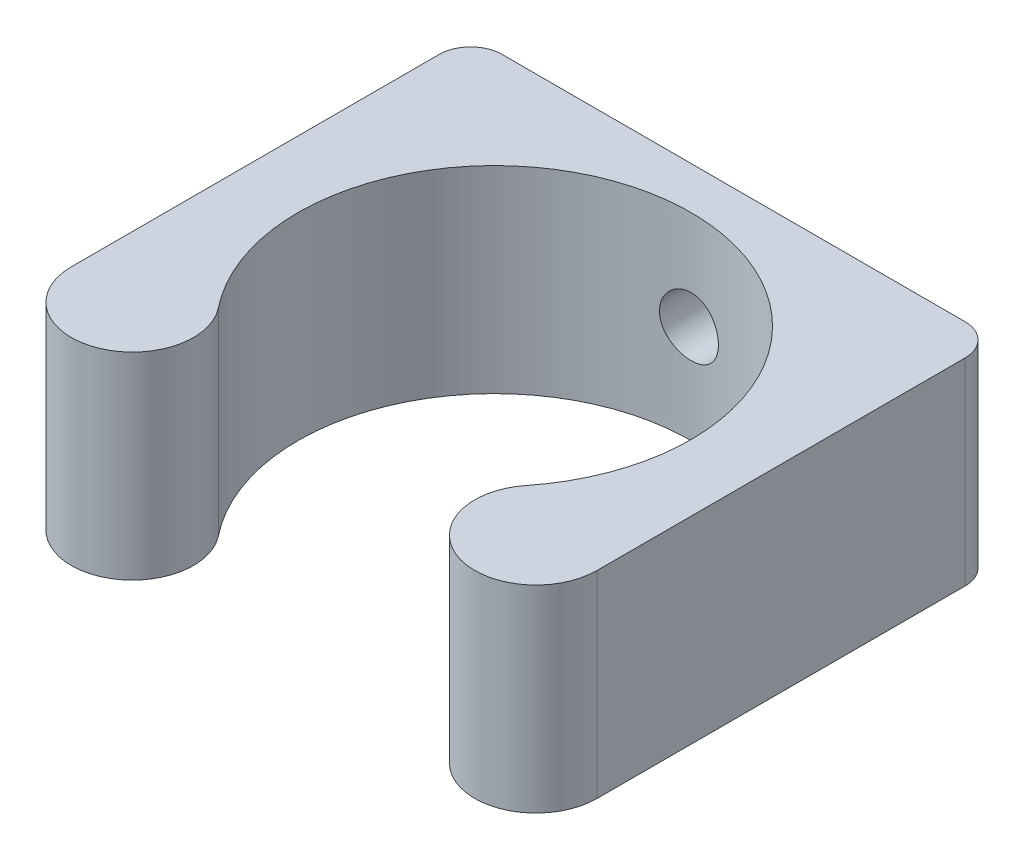
ISO-10303-21;
HEADER;
FILE_DESCRIPTION(('STEP AP214'),'2;1');
FILE_NAME('part.step','',(''),(''),'','','');
FILE_SCHEMA(('AUTOMOTIVE_DESIGN { 1 0 10303 214 1 1 1 1 }'));
ENDSEC;
DATA;
#1=APPLICATION_CONTEXT('core data for automotive mechanical design processes');
#2=APPLICATION_PROTOCOL_DEFINITION('international standard','automotive_design',2000,#1);
#3=PRODUCT_CONTEXT('',#1,'mechanical');
#4=PRODUCT('Part','Part','',(#3));
#5=PRODUCT_RELATED_PRODUCT_CATEGORY('part','',(#4));
#6=PRODUCT_DEFINITION_FORMATION('','',#4);
#7=PRODUCT_DEFINITION_CONTEXT('part definition',#1,'design');
#8=PRODUCT_DEFINITION('design','',#6,#7);
#9=PRODUCT_DEFINITION_SHAPE('','',#8);
#10=(LENGTH_UNIT() NAMED_UNIT(*) SI_UNIT(.MILLI.,.METRE.));
#11=(NAMED_UNIT(*) PLANE_ANGLE_UNIT() SI_UNIT($,.RADIAN.));
#12=(NAMED_UNIT(*) SI_UNIT($,.STERADIAN.) SOLID_ANGLE_UNIT());
#13=UNCERTAINTY_MEASURE_WITH_UNIT(LENGTH_MEASURE(1.E-05),#10,'distance_accuracy_value','');
#14=(GEOMETRIC_REPRESENTATION_CONTEXT(3) GLOBAL_UNCERTAINTY_ASSIGNED_CONTEXT((#13)) GLOBAL_UNIT_ASSIGNED_CONTEXT((#10,
#11,#12)) REPRESENTATION_CONTEXT('',''));
#15=CARTESIAN_POINT('',(0.,0.,0.));
#16=DIRECTION('',(0.,0.,1.));
#17=DIRECTION('',(1.,0.,0.));
#18=AXIS2_PLACEMENT_3D('',#15,#16,#17);
#19=CARTESIAN_POINT('',(-22.6217277158595,15.9512,-20.1948224472424));
#20=DIRECTION('',(0.,-1.,0.));
#21=DIRECTION('',(0.,0.,-1.));
#22=AXIS2_PLACEMENT_3D('',#19,#20,#21);
#23=CYLINDRICAL_SURFACE('',#22,15.875);
#24=CARTESIAN_POINT('',(-25.0029777158595,7.9756,-35.8902126442875));
#25=CARTESIAN_POINT('',(-25.0029722248118,7.84265390874015,-35.8902148665655));
#26=CARTESIAN_POINT('',(-24.9918064210201,7.70963064564748,-35.8919200797123));
#27=CARTESIAN_POINT('',(-24.9474500877827,7.44730331258999,-35.8985520683074));
#28=CARTESIAN_POINT('',(-24.9142380756255,7.31800299876892,-35.9034819859689));
#29=CARTESIAN_POINT('',(-24.8268053176691,7.0669566632397,-35.9159927290331));
#30=CARTESIAN_POINT('',(-24.7726006950524,6.94520492696744,-35.9235715195585));
#31=CARTESIAN_POINT('',(-24.6447593423775,6.71254208864619,-35.9405236536856));
#32=CARTESIAN_POINT('',(-24.5711252875586,6.60162949703396,-35.9498967501804));
#33=CARTESIAN_POINT('',(-24.4058856667543,6.39288819090334,-35.9694652890829));
#34=CARTESIAN_POINT('',(-24.3141552045186,6.29515883871702,-35.9796661387715));
#35=CARTESIAN_POINT('',(-24.1155963395024,6.11641924152166,-35.9996925419185));
#36=CARTESIAN_POINT('',(-24.0087671071081,6.03540991580984,-36.0095180747171));
#37=CARTESIAN_POINT('',(-23.7824066842683,5.89204334719002,-36.0277433376668));
#38=CARTESIAN_POINT('',(-23.6628169268027,5.82977759886311,-36.0361359899076));
#39=CARTESIAN_POINT('',(-23.4147297654044,5.726252836892,-36.050489979341));
#40=CARTESIAN_POINT('',(-23.2862328325392,5.6849927132994,-36.0564514449956));
#41=CARTESIAN_POINT('',(-23.0250021237658,5.62495162070729,-36.0652332196573));
#42=CARTESIAN_POINT('',(-22.8923073823284,5.60600427186037,-36.068076766954));
#43=CARTESIAN_POINT('',(-22.6255936022405,5.59060995346547,-36.0703819579595));
#44=CARTESIAN_POINT('',(-22.491574637622,5.59416173310499,-36.0698437896708));
#45=CARTESIAN_POINT('',(-22.2271518632162,5.62353354869785,-36.0654647543575));
#46=CARTESIAN_POINT('',(-22.096727668262,5.64917458521898,-36.0616504362255));
#47=CARTESIAN_POINT('',(-21.8420543495948,5.72171608753709,-36.0511772633595));
#48=CARTESIAN_POINT('',(-21.7178053849069,5.76861710050853,-36.0445183354132));
#49=CARTESIAN_POINT('',(-21.4784677138866,5.88253045760589,-36.0290585249795));
#50=CARTESIAN_POINT('',(-21.3634154110458,5.94961815711012,-36.0202496405531));
#51=CARTESIAN_POINT('',(-21.1461339132586,6.1019454949511,-36.0014716543884));
#52=CARTESIAN_POINT('',(-21.0439055631031,6.18718632814715,-35.9915024762979));
#53=CARTESIAN_POINT('',(-20.8541187245373,6.37439741251221,-35.9713999585503));
#54=CARTESIAN_POINT('',(-20.7667143927633,6.47652394362755,-35.9612659686366));
#55=CARTESIAN_POINT('',(-20.6102604513559,6.69407645993393,-35.9420716304421));
#56=CARTESIAN_POINT('',(-20.5412109547526,6.80950252701787,-35.9330112887731));
#57=CARTESIAN_POINT('',(-20.4234059038727,7.05053829116827,-35.9169902549212));
#58=CARTESIAN_POINT('',(-20.374666197322,7.17615584968904,-35.9100312035364));
#59=CARTESIAN_POINT('',(-20.2990193785436,7.43392159254648,-35.8990297182649));
#60=CARTESIAN_POINT('',(-20.2721107276295,7.56606931593047,-35.8949870788274));
#61=CARTESIAN_POINT('',(-20.2411012844839,7.83177264220426,-35.8903151131384));
#62=CARTESIAN_POINT('',(-20.2367819640268,7.96530218626994,-35.8896530844832));
#63=CARTESIAN_POINT('',(-20.2504939356699,8.23117828427252,-35.8917304732447));
#64=CARTESIAN_POINT('',(-20.268524534253,8.36352487478809,-35.8944697851179));
#65=CARTESIAN_POINT('',(-20.3262391814844,8.62260121102044,-35.9030111613179));
#66=CARTESIAN_POINT('',(-20.3658143567304,8.7493557628448,-35.9087978214078));
#67=CARTESIAN_POINT('',(-20.4653815086995,8.99443224612717,-35.9227691762264));
#68=CARTESIAN_POINT('',(-20.5253744937219,9.11275376078477,-35.9309539893813));
#69=CARTESIAN_POINT('',(-20.6645993276838,9.33858505078188,-35.9488764687745));
#70=CARTESIAN_POINT('',(-20.7439726359415,9.44600671005671,-35.9586253633122));
#71=CARTESIAN_POINT('',(-20.919508348569,9.64608316504968,-35.9785437282469));
#72=CARTESIAN_POINT('',(-21.0156717022877,9.73873712520008,-35.9887132224008));
#73=CARTESIAN_POINT('',(-21.2230201696998,9.90743288803082,-36.0084291425684));
#74=CARTESIAN_POINT('',(-21.3343237521091,9.98332986858494,-36.0179696721766));
#75=CARTESIAN_POINT('',(-21.5682276634409,10.1153482371044,-36.0352610646256));
#76=CARTESIAN_POINT('',(-21.6908276831998,10.1714701660757,-36.0430119764248));
#77=CARTESIAN_POINT('',(-21.94339214743,10.2621139411997,-36.0558249781075));
#78=CARTESIAN_POINT('',(-22.0733276525871,10.2967149714869,-36.060896914514));
#79=CARTESIAN_POINT('',(-22.3372464212514,10.3435910087657,-36.0678218266706));
#80=CARTESIAN_POINT('',(-22.4712294168272,10.3558674902955,-36.069675015019));
#81=CARTESIAN_POINT('',(-22.7380352538511,10.3577099559722,-36.0699514960561));
#82=CARTESIAN_POINT('',(-22.8708565835712,10.3474975308922,-36.0684082549947));
#83=CARTESIAN_POINT('',(-23.132870640935,10.305127045882,-36.0621327642342));
#84=CARTESIAN_POINT('',(-23.262063380189,10.2729690561788,-36.0574005247401));
#85=CARTESIAN_POINT('',(-23.5130920976872,10.1876988975323,-36.0452763117774));
#86=CARTESIAN_POINT('',(-23.6349333874831,10.1346020714673,-36.0378862861429));
#87=CARTESIAN_POINT('',(-23.8680122405205,10.0089851128264,-36.0212581948644));
#88=CARTESIAN_POINT('',(-23.9792494593467,9.93646434966129,-36.0120200692251));
#89=CARTESIAN_POINT('',(-24.1890864448512,9.77325690310987,-35.9926145535692));
#90=CARTESIAN_POINT('',(-24.287558246341,9.68240661652099,-35.9824392784198));
#91=CARTESIAN_POINT('',(-24.4679395490572,9.48546319648032,-35.9623645991397));
#92=CARTESIAN_POINT('',(-24.5498451575515,9.37936649041233,-35.9524652603188));
#93=CARTESIAN_POINT('',(-24.6951822751677,9.15424098913245,-35.9340036308873));
#94=CARTESIAN_POINT('',(-24.7585073877047,9.03514287553473,-35.9254491660477));
#95=CARTESIAN_POINT('',(-24.8641605860507,8.78792886694566,-35.9107376282335));
#96=CARTESIAN_POINT('',(-24.9065104617297,8.65982248879089,-35.9045780687771));
#97=CARTESIAN_POINT('',(-24.9594000771175,8.43855081993476,-35.8967767801074));
#98=CARTESIAN_POINT('',(-24.9757166861245,8.34675210737959,-35.8943282811763));
#99=CARTESIAN_POINT('',(-24.9975073587618,8.16184821187485,-35.891045445255));
#100=CARTESIAN_POINT('',(-25.0029815629295,8.06874304587504,-35.8902110873426));
#101=CARTESIAN_POINT('',(-25.0029777158595,7.9756,-35.8902126442875));
#102=B_SPLINE_CURVE_WITH_KNOTS('',3,(#24,#25,#26,#27,#28,#29,#30,#31,#32,#33,#34,#35,#36,#37,
#38,#39,#40,#41,#42,#43,#44,#45,#46,#47,#48,#49,#50,#51,#52,#53,#54,#55,#56,#57,#58,#59,#60,#61,
#62,#63,#64,#65,#66,#67,#68,#69,#70,#71,#72,#73,#74,#75,#76,#77,#78,#79,#80,#81,#82,#83,#84,#85,
#86,#87,#88,#89,#90,#91,#92,#93,#94,#95,#96,#97,#98,#99,#100,#101),.UNSPECIFIED.,.T.,.F.,(4,2,2,
2,2,2,2,2,2,2,2,2,2,2,2,2,2,2,2,2,2,2,2,2,2,2,2,2,2,2,2,2,2,2,2,2,2,2,4),(0.,0.398497824757446,
0.797384532962791,1.19596548550381,1.59449158603328,1.99587101858801,2.39727251383253,
2.80060276346272,3.20391169869488,3.60419384151698,4.00445373132099,4.40150031747061,
4.79855712310893,5.19711489766839,5.59569891385313,5.99820277161046,6.40070910794874,
6.80352893443201,7.20632036708735,7.60520790686787,8.00408306949464,8.4009610176005,
8.79785856770054,9.19774459030411,9.59765323073954,10.0008934118705,10.4041225602991,
10.8058591491795,11.2075692023647,11.6053387975379,12.003107119832,12.4005845183765,
12.7980748224113,13.1992838314576,13.6005870075436,14.0041452013882,14.4072832797516,
14.6864775150826,14.9656681315253),.UNSPECIFIED.);
#103=CARTESIAN_POINT('',(-25.0029777158595,7.9756,-35.8902126442875));
#104=VERTEX_POINT('',#103);
#105=EDGE_CURVE('E138',#104,#104,#102,.T.);
#106=ORIENTED_EDGE('',*,*,#105,.F.);
#107=EDGE_LOOP('',(#106));
#108=FACE_BOUND('',#107,.T.);
#109=CARTESIAN_POINT('',(-22.6217277158595,0.,-20.1948224472424));
#110=DIRECTION('',(0.,1.,0.));
#111=DIRECTION('',(0.,0.,1.));
#112=AXIS2_PLACEMENT_3D('',#109,#110,#111);
#113=CIRCLE('',#112,15.875);
#114=CARTESIAN_POINT('',(-10.1953632201835,0.,-10.3154960319141));
#115=VERTEX_POINT('',#114);
#116=CARTESIAN_POINT('',(-35.0480922115355,0.,-10.315496031914));
#117=VERTEX_POINT('',#116);
#118=EDGE_CURVE('E106',#115,#117,#113,.T.);
#119=ORIENTED_EDGE('',*,*,#118,.F.);
#120=DIRECTION('',(0.,-1.,0.));
#121=VECTOR('',#120,1.);
#122=CARTESIAN_POINT('',(-10.1953632201835,15.9512,-10.3154960319141));
#123=LINE('',#122,#121);
#124=CARTESIAN_POINT('',(-10.1953632201835,15.9512,-10.3154960319141));
#125=VERTEX_POINT('',#124);
#126=EDGE_CURVE('E102',#125,#115,#123,.T.);
#127=ORIENTED_EDGE('',*,*,#126,.F.);
#128=CARTESIAN_POINT('',(-22.6217277158595,15.9512,-20.1948224472424));
#129=DIRECTION('',(0.,1.,0.));
#130=DIRECTION('',(0.,0.,1.));
#131=AXIS2_PLACEMENT_3D('',#128,#129,#130);
#132=CIRCLE('',#131,15.875);
#133=CARTESIAN_POINT('',(-35.0480922115355,15.9512,-10.315496031914));
#134=VERTEX_POINT('',#133);
#135=EDGE_CURVE('E104',#125,#134,#132,.T.);
#136=ORIENTED_EDGE('',*,*,#135,.T.);
#137=DIRECTION('',(0.,-1.,0.));
#138=VECTOR('',#137,1.);
#139=CARTESIAN_POINT('',(-35.0480922115355,15.9512,-10.315496031914));
#140=LINE('',#139,#138);
#141=EDGE_CURVE('E135',#134,#117,#140,.T.);
#142=ORIENTED_EDGE('',*,*,#141,.T.);
#143=EDGE_LOOP('',(#119,#127,#136,#142));
#144=FACE_BOUND('',#143,.T.);
#145=ADVANCED_FACE('F36',(#108,#144),#23,.F.);
#146=CARTESIAN_POINT('',(-6.32799280826188,15.9512,-7.24082244724243));
#147=DIRECTION('',(0.,-1.,0.));
#148=DIRECTION('',(0.,0.,-1.));
#149=AXIS2_PLACEMENT_3D('',#146,#147,#148);
#150=CYLINDRICAL_SURFACE('',#149,4.94066509240247);
#151=CARTESIAN_POINT('',(-6.32799280826188,0.,-7.24082244724243));
#152=DIRECTION('',(0.,1.,0.));
#153=DIRECTION('',(0.,0.,1.));
#154=AXIS2_PLACEMENT_3D('',#151,#152,#153);
#155=CIRCLE('',#154,4.94066509240247);
#156=CARTESIAN_POINT('',(-1.38732771585941,0.,-7.24082244724245));
#157=VERTEX_POINT('',#156);
#158=EDGE_CURVE('E137',#157,#115,#155,.F.);
#159=ORIENTED_EDGE('',*,*,#158,.F.);
#160=DIRECTION('',(0.,-1.,0.));
#161=VECTOR('',#160,1.);
#162=CARTESIAN_POINT('',(-1.38732771585941,15.9512,-7.24082244724245));
#163=LINE('',#162,#161);
#164=CARTESIAN_POINT('',(-1.38732771585941,15.9512,-7.24082244724245));
#165=VERTEX_POINT('',#164);
#166=EDGE_CURVE('E112',#165,#157,#163,.T.);
#167=ORIENTED_EDGE('',*,*,#166,.F.);
#168=CARTESIAN_POINT('',(-6.32799280826188,15.9512,-7.24082244724243));
#169=DIRECTION('',(0.,1.,0.));
#170=DIRECTION('',(0.,0.,1.));
#171=AXIS2_PLACEMENT_3D('',#168,#169,#170);
#172=CIRCLE('',#171,4.94066509240247);
#173=EDGE_CURVE('E116',#165,#125,#172,.F.);
#174=ORIENTED_EDGE('',*,*,#173,.T.);
#175=ORIENTED_EDGE('',*,*,#126,.T.);
#176=EDGE_LOOP('',(#159,#167,#174,#175));
#177=FACE_BOUND('',#176,.T.);
#178=ADVANCED_FACE('F123',(#177),#150,.T.);
#179=CARTESIAN_POINT('',(-1.38732771585938,15.9512,0.));
#180=DIRECTION('',(-1.,0.,0.));
#181=DIRECTION('',(0.,0.,1.));
#182=AXIS2_PLACEMENT_3D('',#179,#180,#181);
#183=PLANE('',#182);
#184=DIRECTION('',(0.,0.,-1.));
#185=VECTOR('',#184,1.);
#186=CARTESIAN_POINT('',(-1.38732771585938,0.,0.));
#187=LINE('',#186,#185);
#188=CARTESIAN_POINT('',(-1.38732771585954,0.,-36.9588224472424));
#189=VERTEX_POINT('',#188);
#190=EDGE_CURVE('E140',#157,#189,#187,.T.);
#191=ORIENTED_EDGE('',*,*,#190,.T.);
#192=DIRECTION('',(0.,-1.,0.));
#193=VECTOR('',#192,1.);
#194=CARTESIAN_POINT('',(-1.38732771585954,15.9512,-36.9588224472424));
#195=LINE('',#194,#193);
#196=CARTESIAN_POINT('',(-1.38732771585954,15.9512,-36.9588224472424));
#197=VERTEX_POINT('',#196);
#198=EDGE_CURVE('E11',#189,#197,#195,.F.);
#199=ORIENTED_EDGE('',*,*,#198,.T.);
#200=DIRECTION('',(0.,0.,-1.));
#201=VECTOR('',#200,1.);
#202=CARTESIAN_POINT('',(-1.38732771585938,15.9512,0.));
#203=LINE('',#202,#201);
#204=EDGE_CURVE('E124',#165,#197,#203,.T.);
#205=ORIENTED_EDGE('',*,*,#204,.F.);
#206=ORIENTED_EDGE('',*,*,#166,.T.);
#207=EDGE_LOOP('',(#191,#199,#205,#206));
#208=FACE_BOUND('',#207,.T.);
#209=ADVANCED_FACE('F182',(#208),#183,.F.);
#210=CARTESIAN_POINT('',(0.,15.9512,-39.4988224472424));
#211=DIRECTION('',(0.,0.,-1.));
#212=DIRECTION('',(-1.,0.,0.));
#213=AXIS2_PLACEMENT_3D('',#210,#211,#212);
#214=PLANE('',#213);
#215=CARTESIAN_POINT('',(-22.6217277158595,7.9756,-39.4988224472424));
#216=DIRECTION('',(0.,0.,-1.));
#217=DIRECTION('',(-1.,0.,0.));
#218=AXIS2_PLACEMENT_3D('',#215,#216,#217);
#219=CIRCLE('',#218,2.38125);
#220=CARTESIAN_POINT('',(-25.0029777158595,7.9756,-39.4988224472424));
#221=VERTEX_POINT('',#220);
#222=EDGE_CURVE('E205',#221,#221,#219,.T.);
#223=ORIENTED_EDGE('',*,*,#222,.F.);
#224=EDGE_LOOP('',(#223));
#225=FACE_BOUND('',#224,.T.);
#226=DIRECTION('',(1.,0.,0.));
#227=VECTOR('',#226,1.);
#228=CARTESIAN_POINT('',(0.,0.,-39.4988224472424));
#229=LINE('',#228,#227);
#230=CARTESIAN_POINT('',(-41.3161277158595,0.,-39.4988224472424));
#231=VERTEX_POINT('',#230);
#232=CARTESIAN_POINT('',(-3.92732771585954,0.,-39.4988224472424));
#233=VERTEX_POINT('',#232);
#234=EDGE_CURVE('E142',#231,#233,#229,.T.);
#235=ORIENTED_EDGE('',*,*,#234,.F.);
#236=DIRECTION('',(0.,-1.,0.));
#237=VECTOR('',#236,1.);
#238=CARTESIAN_POINT('',(-41.3161277158595,15.9512,-39.4988224472424));
#239=LINE('',#238,#237);
#240=CARTESIAN_POINT('',(-41.3161277158595,15.9512,-39.4988224472424));
#241=VERTEX_POINT('',#240);
#242=EDGE_CURVE('E163',#231,#241,#239,.F.);
#243=ORIENTED_EDGE('',*,*,#242,.T.);
#244=DIRECTION('',(1.,0.,0.));
#245=VECTOR('',#244,1.);
#246=CARTESIAN_POINT('',(0.,15.9512,-39.4988224472424));
#247=LINE('',#246,#245);
#248=CARTESIAN_POINT('',(-3.92732771585954,15.9512,-39.4988224472424));
#249=VERTEX_POINT('',#248);
#250=EDGE_CURVE('E126',#241,#249,#247,.T.);
#251=ORIENTED_EDGE('',*,*,#250,.T.);
#252=DIRECTION('',(0.,-1.,0.));
#253=VECTOR('',#252,1.);
#254=CARTESIAN_POINT('',(-3.92732771585954,0.,-39.4988224472424));
#255=LINE('',#254,#253);
#256=EDGE_CURVE('E160',#249,#233,#255,.T.);
#257=ORIENTED_EDGE('',*,*,#256,.T.);
#258=EDGE_LOOP('',(#235,#243,#251,#257));
#259=FACE_BOUND('',#258,.T.);
#260=ADVANCED_FACE('F178',(#225,#259),#214,.T.);
#261=CARTESIAN_POINT('',(-43.8561277158595,15.9512,0.));
#262=DIRECTION('',(-1.,0.,0.));
#263=DIRECTION('',(0.,0.,1.));
#264=AXIS2_PLACEMENT_3D('',#261,#262,#263);
#265=PLANE('',#264);
#266=DIRECTION('',(0.,0.,-1.));
#267=VECTOR('',#266,1.);
#268=CARTESIAN_POINT('',(-43.8561277158595,15.9512,0.));
#269=LINE('',#268,#267);
#270=CARTESIAN_POINT('',(-43.8561277158595,15.9512,-7.24082244724236));
#271=VERTEX_POINT('',#270);
#272=CARTESIAN_POINT('',(-43.8561277158595,15.9512,-36.9588224472424));
#273=VERTEX_POINT('',#272);
#274=EDGE_CURVE('E131',#271,#273,#269,.T.);
#275=ORIENTED_EDGE('',*,*,#274,.T.);
#276=DIRECTION('',(0.,-1.,0.));
#277=VECTOR('',#276,1.);
#278=CARTESIAN_POINT('',(-43.8561277158595,15.9512,-36.9588224472424));
#279=LINE('',#278,#277);
#280=CARTESIAN_POINT('',(-43.8561277158595,0.,-36.9588224472424));
#281=VERTEX_POINT('',#280);
#282=EDGE_CURVE('E111',#273,#281,#279,.T.);
#283=ORIENTED_EDGE('',*,*,#282,.T.);
#284=DIRECTION('',(0.,0.,-1.));
#285=VECTOR('',#284,1.);
#286=CARTESIAN_POINT('',(-43.8561277158595,0.,0.));
#287=LINE('',#286,#285);
#288=CARTESIAN_POINT('',(-43.8561277158595,0.,-7.24082244724236));
#289=VERTEX_POINT('',#288);
#290=EDGE_CURVE('E145',#289,#281,#287,.T.);
#291=ORIENTED_EDGE('',*,*,#290,.F.);
#292=DIRECTION('',(0.,-1.,0.));
#293=VECTOR('',#292,1.);
#294=CARTESIAN_POINT('',(-43.8561277158595,15.9512,-7.24082244724236));
#295=LINE('',#294,#293);
#296=EDGE_CURVE('E151',#271,#289,#295,.T.);
#297=ORIENTED_EDGE('',*,*,#296,.F.);
#298=EDGE_LOOP('',(#275,#283,#291,#297));
#299=FACE_BOUND('',#298,.T.);
#300=ADVANCED_FACE('F170',(#299),#265,.T.);
#301=CARTESIAN_POINT('',(-38.9154626234571,15.9512,-7.24082244724236));
#302=DIRECTION('',(0.,-1.,0.));
#303=DIRECTION('',(0.,0.,-1.));
#304=AXIS2_PLACEMENT_3D('',#301,#302,#303);
#305=CYLINDRICAL_SURFACE('',#304,4.94066509240247);
#306=CARTESIAN_POINT('',(-38.9154626234571,0.,-7.24082244724236));
#307=DIRECTION('',(0.,1.,0.));
#308=DIRECTION('',(0.,0.,1.));
#309=AXIS2_PLACEMENT_3D('',#306,#307,#308);
#310=CIRCLE('',#309,4.94066509240247);
#311=EDGE_CURVE('E121',#289,#117,#310,.T.);
#312=ORIENTED_EDGE('',*,*,#311,.T.);
#313=ORIENTED_EDGE('',*,*,#141,.F.);
#314=CARTESIAN_POINT('',(-38.9154626234571,15.9512,-7.24082244724236));
#315=DIRECTION('',(0.,1.,0.));
#316=DIRECTION('',(0.,0.,1.));
#317=AXIS2_PLACEMENT_3D('',#314,#315,#316);
#318=CIRCLE('',#317,4.94066509240247);
#319=EDGE_CURVE('E119',#271,#134,#318,.T.);
#320=ORIENTED_EDGE('',*,*,#319,.F.);
#321=ORIENTED_EDGE('',*,*,#296,.T.);
#322=EDGE_LOOP('',(#312,#313,#320,#321));
#323=FACE_BOUND('',#322,.T.);
#324=ADVANCED_FACE('F213',(#323),#305,.T.);
#325=CARTESIAN_POINT('',(0.,15.9512,0.));
#326=DIRECTION('',(0.,1.,0.));
#327=DIRECTION('',(0.,0.,1.));
#328=AXIS2_PLACEMENT_3D('',#325,#326,#327);
#329=PLANE('',#328);
#330=ORIENTED_EDGE('',*,*,#250,.F.);
#331=CARTESIAN_POINT('',(-41.3161277158595,15.9512,-36.9588224472424));
#332=DIRECTION('',(0.,1.,0.));
#333=DIRECTION('',(0.,0.,1.));
#334=AXIS2_PLACEMENT_3D('',#331,#332,#333);
#335=CIRCLE('',#334,2.54);
#336=EDGE_CURVE('E44',#241,#273,#335,.T.);
#337=ORIENTED_EDGE('',*,*,#336,.T.);
#338=ORIENTED_EDGE('',*,*,#274,.F.);
#339=ORIENTED_EDGE('',*,*,#319,.T.);
#340=ORIENTED_EDGE('',*,*,#135,.F.);
#341=ORIENTED_EDGE('',*,*,#173,.F.);
#342=ORIENTED_EDGE('',*,*,#204,.T.);
#343=CARTESIAN_POINT('',(-3.92732771585954,15.9512,-36.9588224472424));
#344=DIRECTION('',(0.,1.,0.));
#345=DIRECTION('',(0.,0.,1.));
#346=AXIS2_PLACEMENT_3D('',#343,#344,#345);
#347=CIRCLE('',#346,2.54);
#348=EDGE_CURVE('E56',#197,#249,#347,.T.);
#349=ORIENTED_EDGE('',*,*,#348,.T.);
#350=EDGE_LOOP('',(#330,#337,#338,#339,#340,#341,#342,#349));
#351=FACE_BOUND('',#350,.T.);
#352=ADVANCED_FACE('F115',(#351),#329,.T.);
#353=CARTESIAN_POINT('',(0.,0.,0.));
#354=DIRECTION('',(0.,1.,0.));
#355=DIRECTION('',(0.,0.,1.));
#356=AXIS2_PLACEMENT_3D('',#353,#354,#355);
#357=PLANE('',#356);
#358=ORIENTED_EDGE('',*,*,#290,.T.);
#359=CARTESIAN_POINT('',(-41.3161277158595,0.,-36.9588224472424));
#360=DIRECTION('',(0.,1.,0.));
#361=DIRECTION('',(0.,0.,1.));
#362=AXIS2_PLACEMENT_3D('',#359,#360,#361);
#363=CIRCLE('',#362,2.54);
#364=EDGE_CURVE('E158',#281,#231,#363,.F.);
#365=ORIENTED_EDGE('',*,*,#364,.T.);
#366=ORIENTED_EDGE('',*,*,#234,.T.);
#367=CARTESIAN_POINT('',(-3.92732771585954,0.,-36.9588224472424));
#368=DIRECTION('',(0.,1.,0.));
#369=DIRECTION('',(0.,0.,1.));
#370=AXIS2_PLACEMENT_3D('',#367,#368,#369);
#371=CIRCLE('',#370,2.54);
#372=EDGE_CURVE('E156',#233,#189,#371,.F.);
#373=ORIENTED_EDGE('',*,*,#372,.T.);
#374=ORIENTED_EDGE('',*,*,#190,.F.);
#375=ORIENTED_EDGE('',*,*,#158,.T.);
#376=ORIENTED_EDGE('',*,*,#118,.T.);
#377=ORIENTED_EDGE('',*,*,#311,.F.);
#378=EDGE_LOOP('',(#358,#365,#366,#373,#374,#375,#376,#377));
#379=FACE_BOUND('',#378,.T.);
#380=ADVANCED_FACE('F175',(#379),#357,.F.);
#381=CARTESIAN_POINT('',(-41.3161277158595,15.9512,-36.9588224472424));
#382=DIRECTION('',(0.,-1.,0.));
#383=DIRECTION('',(0.,0.,-1.));
#384=AXIS2_PLACEMENT_3D('',#381,#382,#383);
#385=CYLINDRICAL_SURFACE('',#384,2.54);
#386=ORIENTED_EDGE('',*,*,#336,.F.);
#387=ORIENTED_EDGE('',*,*,#242,.F.);
#388=ORIENTED_EDGE('',*,*,#364,.F.);
#389=ORIENTED_EDGE('',*,*,#282,.F.);
#390=EDGE_LOOP('',(#386,#387,#388,#389));
#391=FACE_BOUND('',#390,.T.);
#392=ADVANCED_FACE('F172',(#391),#385,.T.);
#393=CARTESIAN_POINT('',(-3.92732771585954,15.9512,-36.9588224472424));
#394=DIRECTION('',(0.,1.,0.));
#395=DIRECTION('',(0.,0.,1.));
#396=AXIS2_PLACEMENT_3D('',#393,#394,#395);
#397=CYLINDRICAL_SURFACE('',#396,2.54);
#398=ORIENTED_EDGE('',*,*,#348,.F.);
#399=ORIENTED_EDGE('',*,*,#198,.F.);
#400=ORIENTED_EDGE('',*,*,#372,.F.);
#401=ORIENTED_EDGE('',*,*,#256,.F.);
#402=EDGE_LOOP('',(#398,#399,#400,#401));
#403=FACE_BOUND('',#402,.T.);
#404=ADVANCED_FACE('F38',(#403),#397,.T.);
#405=CARTESIAN_POINT('',(-22.6217277158595,7.9756,-2.30015735483986));
#406=DIRECTION('',(0.,0.,-1.));
#407=DIRECTION('',(-1.,0.,0.));
#408=AXIS2_PLACEMENT_3D('',#405,#406,#407);
#409=CYLINDRICAL_SURFACE('',#408,2.38125);
#410=ORIENTED_EDGE('',*,*,#105,.T.);
#411=EDGE_LOOP('',(#410));
#412=FACE_BOUND('',#411,.T.);
#413=ORIENTED_EDGE('',*,*,#222,.T.);
#414=EDGE_LOOP('',(#413));
#415=FACE_BOUND('',#414,.T.);
#416=ADVANCED_FACE('F206',(#412,#415),#409,.F.);
#417=CLOSED_SHELL('',(#145,#178,#209,#260,#300,#324,#352,#380,#392,#404,#416));
#418=MANIFOLD_SOLID_BREP('B2',#417);
#419=ADVANCED_BREP_SHAPE_REPRESENTATION('',(#18,#418),#14);
#420=SHAPE_DEFINITION_REPRESENTATION(#9,#419);
ENDSEC;
END-ISO-10303-21;
